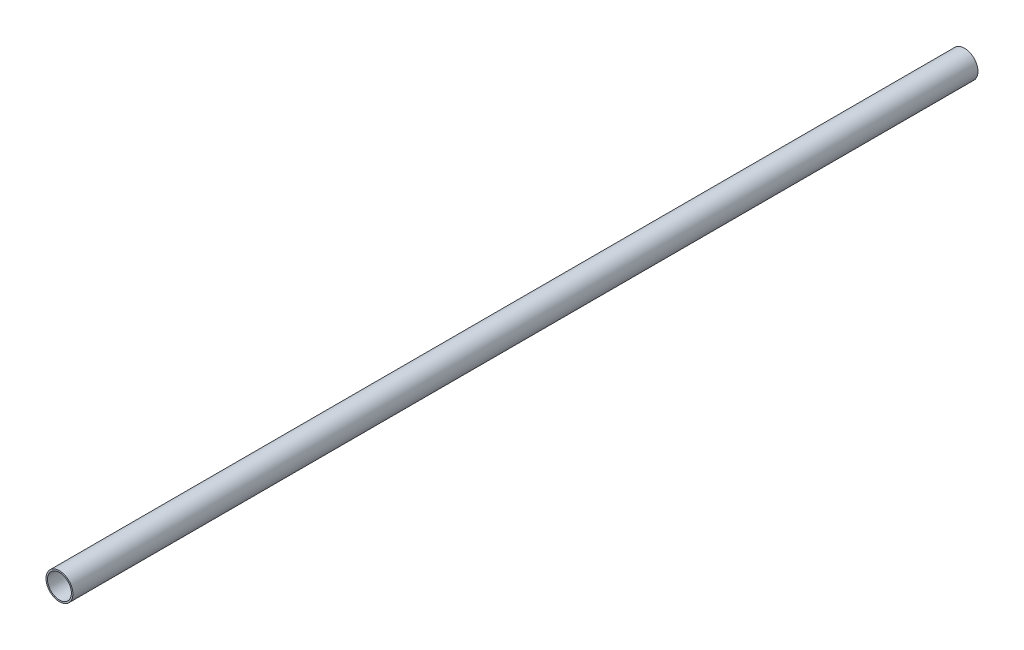
ISO-10303-21;
HEADER;
FILE_DESCRIPTION(('STEP AP214'),'2;1');
FILE_NAME('part.step','',(''),(''),'','','');
FILE_SCHEMA(('AUTOMOTIVE_DESIGN { 1 0 10303 214 1 1 1 1 }'));
ENDSEC;
DATA;
#1=APPLICATION_CONTEXT('core data for automotive mechanical design processes');
#2=APPLICATION_PROTOCOL_DEFINITION('international standard','automotive_design',2000,#1);
#3=PRODUCT_CONTEXT('',#1,'mechanical');
#4=PRODUCT('Part','Part','',(#3));
#5=PRODUCT_RELATED_PRODUCT_CATEGORY('part','',(#4));
#6=PRODUCT_DEFINITION_FORMATION('','',#4);
#7=PRODUCT_DEFINITION_CONTEXT('part definition',#1,'design');
#8=PRODUCT_DEFINITION('design','',#6,#7);
#9=PRODUCT_DEFINITION_SHAPE('','',#8);
#10=(LENGTH_UNIT() NAMED_UNIT(*) SI_UNIT(.MILLI.,.METRE.));
#11=(NAMED_UNIT(*) PLANE_ANGLE_UNIT() SI_UNIT($,.RADIAN.));
#12=(NAMED_UNIT(*) SI_UNIT($,.STERADIAN.) SOLID_ANGLE_UNIT());
#13=UNCERTAINTY_MEASURE_WITH_UNIT(LENGTH_MEASURE(1.E-05),#10,'distance_accuracy_value','');
#14=(GEOMETRIC_REPRESENTATION_CONTEXT(3) GLOBAL_UNCERTAINTY_ASSIGNED_CONTEXT((#13)) GLOBAL_UNIT_ASSIGNED_CONTEXT((#10,
#11,#12)) REPRESENTATION_CONTEXT('',''));
#15=CARTESIAN_POINT('',(0.,0.,0.));
#16=DIRECTION('',(0.,0.,1.));
#17=DIRECTION('',(1.,0.,0.));
#18=AXIS2_PLACEMENT_3D('',#15,#16,#17);
#19=CARTESIAN_POINT('',(0.,0.,533.4));
#20=DIRECTION('',(0.,0.,1.));
#21=DIRECTION('',(1.,0.,0.));
#22=AXIS2_PLACEMENT_3D('',#19,#20,#21);
#23=PLANE('',#22);
#24=CARTESIAN_POINT('',(0.,0.,533.4));
#25=DIRECTION('',(0.,0.,1.));
#26=DIRECTION('',(1.,0.,0.));
#27=AXIS2_PLACEMENT_3D('',#24,#25,#26);
#28=CIRCLE('',#27,7.9375);
#29=CARTESIAN_POINT('',(7.9375,0.,533.4));
#30=VERTEX_POINT('',#29);
#31=EDGE_CURVE('E10',#30,#30,#28,.T.);
#32=ORIENTED_EDGE('',*,*,#31,.T.);
#33=EDGE_LOOP('',(#32));
#34=FACE_BOUND('',#33,.T.);
#35=CARTESIAN_POINT('',(0.,0.,533.4));
#36=DIRECTION('',(0.,0.,1.));
#37=DIRECTION('',(1.,0.,0.));
#38=AXIS2_PLACEMENT_3D('',#35,#36,#37);
#39=CIRCLE('',#38,7.0485);
#40=CARTESIAN_POINT('',(7.0485,0.,533.4));
#41=VERTEX_POINT('',#40);
#42=EDGE_CURVE('E55',#41,#41,#39,.T.);
#43=ORIENTED_EDGE('',*,*,#42,.F.);
#44=EDGE_LOOP('',(#43));
#45=FACE_BOUND('',#44,.T.);
#46=ADVANCED_FACE('F42',(#34,#45),#23,.T.);
#47=CARTESIAN_POINT('',(0.,0.,0.));
#48=DIRECTION('',(0.,0.,1.));
#49=DIRECTION('',(1.,0.,0.));
#50=AXIS2_PLACEMENT_3D('',#47,#48,#49);
#51=PLANE('',#50);
#52=CARTESIAN_POINT('',(0.,0.,0.));
#53=DIRECTION('',(0.,0.,1.));
#54=DIRECTION('',(1.,0.,0.));
#55=AXIS2_PLACEMENT_3D('',#52,#53,#54);
#56=CIRCLE('',#55,7.9375);
#57=CARTESIAN_POINT('',(7.9375,0.,0.));
#58=VERTEX_POINT('',#57);
#59=EDGE_CURVE('E46',#58,#58,#56,.T.);
#60=ORIENTED_EDGE('',*,*,#59,.F.);
#61=EDGE_LOOP('',(#60));
#62=FACE_BOUND('',#61,.T.);
#63=CARTESIAN_POINT('',(0.,0.,0.));
#64=DIRECTION('',(0.,0.,1.));
#65=DIRECTION('',(1.,0.,0.));
#66=AXIS2_PLACEMENT_3D('',#63,#64,#65);
#67=CIRCLE('',#66,7.0485);
#68=CARTESIAN_POINT('',(7.0485,0.,0.));
#69=VERTEX_POINT('',#68);
#70=EDGE_CURVE('E57',#69,#69,#67,.T.);
#71=ORIENTED_EDGE('',*,*,#70,.T.);
#72=EDGE_LOOP('',(#71));
#73=FACE_BOUND('',#72,.T.);
#74=ADVANCED_FACE('F69',(#62,#73),#51,.F.);
#75=CARTESIAN_POINT('',(0.,0.,533.4));
#76=DIRECTION('',(0.,0.,-1.));
#77=DIRECTION('',(-1.,0.,0.));
#78=AXIS2_PLACEMENT_3D('',#75,#76,#77);
#79=CYLINDRICAL_SURFACE('',#78,7.9375);
#80=ORIENTED_EDGE('',*,*,#31,.F.);
#81=EDGE_LOOP('',(#80));
#82=FACE_BOUND('',#81,.T.);
#83=ORIENTED_EDGE('',*,*,#59,.T.);
#84=EDGE_LOOP('',(#83));
#85=FACE_BOUND('',#84,.T.);
#86=ADVANCED_FACE('F44',(#82,#85),#79,.T.);
#87=CARTESIAN_POINT('',(0.,0.,533.4));
#88=DIRECTION('',(0.,0.,-1.));
#89=DIRECTION('',(-1.,0.,0.));
#90=AXIS2_PLACEMENT_3D('',#87,#88,#89);
#91=CYLINDRICAL_SURFACE('',#90,7.0485);
#92=ORIENTED_EDGE('',*,*,#42,.T.);
#93=EDGE_LOOP('',(#92));
#94=FACE_BOUND('',#93,.T.);
#95=ORIENTED_EDGE('',*,*,#70,.F.);
#96=EDGE_LOOP('',(#95));
#97=FACE_BOUND('',#96,.T.);
#98=ADVANCED_FACE('F65',(#94,#97),#91,.F.);
#99=CLOSED_SHELL('',(#46,#74,#86,#98));
#100=MANIFOLD_SOLID_BREP('B2',#99);
#101=ADVANCED_BREP_SHAPE_REPRESENTATION('',(#18,#100),#14);
#102=SHAPE_DEFINITION_REPRESENTATION(#9,#101);
ENDSEC;
END-ISO-10303-21;
